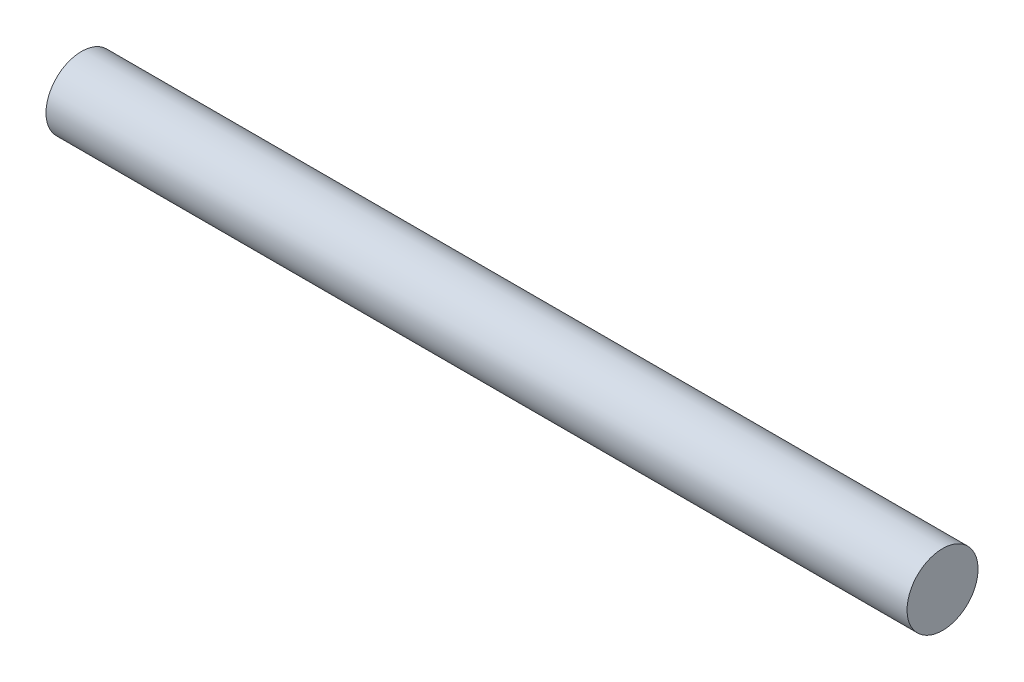
ISO-10303-21;
HEADER;
FILE_DESCRIPTION(('STEP AP214'),'2;1');
FILE_NAME('part.step','',(''),(''),'','','');
FILE_SCHEMA(('AUTOMOTIVE_DESIGN { 1 0 10303 214 1 1 1 1 }'));
ENDSEC;
DATA;
#1=APPLICATION_CONTEXT('core data for automotive mechanical design processes');
#2=APPLICATION_PROTOCOL_DEFINITION('international standard','automotive_design',2000,#1);
#3=PRODUCT_CONTEXT('',#1,'mechanical');
#4=PRODUCT('Part','Part','',(#3));
#5=PRODUCT_RELATED_PRODUCT_CATEGORY('part','',(#4));
#6=PRODUCT_DEFINITION_FORMATION('','',#4);
#7=PRODUCT_DEFINITION_CONTEXT('part definition',#1,'design');
#8=PRODUCT_DEFINITION('design','',#6,#7);
#9=PRODUCT_DEFINITION_SHAPE('','',#8);
#10=(LENGTH_UNIT() NAMED_UNIT(*) SI_UNIT(.MILLI.,.METRE.));
#11=(NAMED_UNIT(*) PLANE_ANGLE_UNIT() SI_UNIT($,.RADIAN.));
#12=(NAMED_UNIT(*) SI_UNIT($,.STERADIAN.) SOLID_ANGLE_UNIT());
#13=UNCERTAINTY_MEASURE_WITH_UNIT(LENGTH_MEASURE(1.E-05),#10,'distance_accuracy_value','');
#14=(GEOMETRIC_REPRESENTATION_CONTEXT(3) GLOBAL_UNCERTAINTY_ASSIGNED_CONTEXT((#13)) GLOBAL_UNIT_ASSIGNED_CONTEXT((#10,
#11,#12)) REPRESENTATION_CONTEXT('',''));
#15=CARTESIAN_POINT('',(0.,0.,0.));
#16=DIRECTION('',(0.,0.,1.));
#17=DIRECTION('',(1.,0.,0.));
#18=AXIS2_PLACEMENT_3D('',#15,#16,#17);
#19=CARTESIAN_POINT('',(48.5,0.,0.));
#20=DIRECTION('',(-1.,0.,0.));
#21=DIRECTION('',(0.,0.,1.));
#22=AXIS2_PLACEMENT_3D('',#19,#20,#21);
#23=CYLINDRICAL_SURFACE('',#22,4.);
#24=CARTESIAN_POINT('',(48.5,0.,0.));
#25=DIRECTION('',(1.,0.,0.));
#26=DIRECTION('',(0.,0.,-1.));
#27=AXIS2_PLACEMENT_3D('',#24,#25,#26);
#28=CIRCLE('',#27,4.);
#29=CARTESIAN_POINT('',(48.5,0.,4.));
#30=VERTEX_POINT('',#29);
#31=EDGE_CURVE('E10',#30,#30,#28,.T.);
#32=CARTESIAN_POINT('',(-48.5,0.,0.));
#33=DIRECTION('',(1.,0.,0.));
#34=DIRECTION('',(0.,0.,-1.));
#35=AXIS2_PLACEMENT_3D('',#32,#33,#34);
#36=CIRCLE('',#35,4.);
#37=CARTESIAN_POINT('',(-48.5,0.,4.));
#38=VERTEX_POINT('',#37);
#39=EDGE_CURVE('E44',#38,#38,#36,.T.);
#40=CARTESIAN_POINT('',(48.5,0.,4.));
#41=CARTESIAN_POINT('',(47.4895833333333,0.,4.));
#42=CARTESIAN_POINT('',(46.4791666666667,0.,4.));
#43=CARTESIAN_POINT('',(44.4583333333333,0.,4.));
#44=CARTESIAN_POINT('',(43.4479166666667,0.,4.));
#45=CARTESIAN_POINT('',(41.4270833333333,0.,4.));
#46=CARTESIAN_POINT('',(40.4166666666667,0.,4.));
#47=CARTESIAN_POINT('',(38.3958333333333,0.,4.));
#48=CARTESIAN_POINT('',(37.3854166666667,0.,4.));
#49=CARTESIAN_POINT('',(35.3645833333333,0.,4.));
#50=CARTESIAN_POINT('',(34.3541666666667,0.,4.));
#51=CARTESIAN_POINT('',(32.3333333333333,0.,4.));
#52=CARTESIAN_POINT('',(31.3229166666667,0.,4.));
#53=CARTESIAN_POINT('',(29.3020833333333,0.,4.));
#54=CARTESIAN_POINT('',(28.2916666666667,0.,4.));
#55=CARTESIAN_POINT('',(26.2708333333333,0.,4.));
#56=CARTESIAN_POINT('',(25.2604166666667,0.,4.));
#57=CARTESIAN_POINT('',(23.2395833333333,0.,4.));
#58=CARTESIAN_POINT('',(22.2291666666667,0.,4.));
#59=CARTESIAN_POINT('',(20.2083333333333,0.,4.));
#60=CARTESIAN_POINT('',(19.1979166666667,0.,4.));
#61=CARTESIAN_POINT('',(17.1770833333333,0.,4.));
#62=CARTESIAN_POINT('',(16.1666666666667,0.,4.));
#63=CARTESIAN_POINT('',(14.1458333333333,0.,4.));
#64=CARTESIAN_POINT('',(13.1354166666667,0.,4.));
#65=CARTESIAN_POINT('',(11.1145833333333,0.,4.));
#66=CARTESIAN_POINT('',(10.1041666666667,0.,4.));
#67=CARTESIAN_POINT('',(8.08333333333332,0.,4.));
#68=CARTESIAN_POINT('',(7.07291666666665,0.,4.));
#69=CARTESIAN_POINT('',(5.05208333333332,0.,4.));
#70=CARTESIAN_POINT('',(4.04166666666665,0.,4.));
#71=CARTESIAN_POINT('',(2.02083333333332,0.,4.));
#72=CARTESIAN_POINT('',(1.01041666666665,0.,4.));
#73=CARTESIAN_POINT('',(-1.01041666666668,0.,4.));
#74=CARTESIAN_POINT('',(-2.02083333333335,0.,4.));
#75=CARTESIAN_POINT('',(-4.04166666666668,0.,4.));
#76=CARTESIAN_POINT('',(-5.05208333333335,0.,4.));
#77=CARTESIAN_POINT('',(-7.07291666666668,0.,4.));
#78=CARTESIAN_POINT('',(-8.08333333333335,0.,4.));
#79=CARTESIAN_POINT('',(-10.1041666666667,0.,4.));
#80=CARTESIAN_POINT('',(-11.1145833333334,0.,4.));
#81=CARTESIAN_POINT('',(-13.1354166666667,0.,4.));
#82=CARTESIAN_POINT('',(-14.1458333333333,0.,4.));
#83=CARTESIAN_POINT('',(-16.1666666666667,0.,4.));
#84=CARTESIAN_POINT('',(-17.1770833333333,0.,4.));
#85=CARTESIAN_POINT('',(-19.1979166666667,0.,4.));
#86=CARTESIAN_POINT('',(-20.2083333333333,0.,4.));
#87=CARTESIAN_POINT('',(-22.2291666666667,0.,4.));
#88=CARTESIAN_POINT('',(-23.2395833333333,0.,4.));
#89=CARTESIAN_POINT('',(-25.2604166666667,0.,4.));
#90=CARTESIAN_POINT('',(-26.2708333333333,0.,4.));
#91=CARTESIAN_POINT('',(-28.2916666666667,0.,4.));
#92=CARTESIAN_POINT('',(-29.3020833333333,0.,4.));
#93=CARTESIAN_POINT('',(-31.3229166666667,0.,4.));
#94=CARTESIAN_POINT('',(-32.3333333333333,0.,4.));
#95=CARTESIAN_POINT('',(-34.3541666666667,0.,4.));
#96=CARTESIAN_POINT('',(-35.3645833333333,0.,4.));
#97=CARTESIAN_POINT('',(-37.3854166666667,0.,4.));
#98=CARTESIAN_POINT('',(-38.3958333333333,0.,4.));
#99=CARTESIAN_POINT('',(-40.4166666666667,0.,4.));
#100=CARTESIAN_POINT('',(-41.4270833333333,0.,4.));
#101=CARTESIAN_POINT('',(-43.4479166666667,0.,4.));
#102=CARTESIAN_POINT('',(-44.4583333333333,0.,4.));
#103=CARTESIAN_POINT('',(-46.4791666666667,0.,4.));
#104=CARTESIAN_POINT('',(-47.4895833333333,0.,4.));
#105=CARTESIAN_POINT('',(-48.5,0.,4.));
#106=B_SPLINE_CURVE_WITH_KNOTS('',3,(#40,#41,#42,#43,#44,#45,#46,#47,#48,#49,#50,#51,#52,#53,
#54,#55,#56,#57,#58,#59,#60,#61,#62,#63,#64,#65,#66,#67,#68,#69,#70,#71,#72,#73,#74,#75,#76,#77,
#78,#79,#80,#81,#82,#83,#84,#85,#86,#87,#88,#89,#90,#91,#92,#93,#94,#95,#96,#97,#98,#99,#100,
#101,#102,#103,#104,#105),.UNSPECIFIED.,.F.,.F.,(4,2,2,2,2,2,2,2,2,2,2,2,2,2,2,2,2,2,2,2,2,2,2,
2,2,2,2,2,2,2,2,2,4),(0.,3.03125,6.0625,9.09375,12.125,15.15625,18.1875,21.21875,24.25,27.28125,
30.3125,33.34375,36.375,39.40625,42.4375,45.46875,48.5,51.53125,54.5625,57.59375,60.625,
63.65625,66.6875,69.71875,72.75,75.78125,78.8125,81.84375,84.875,87.90625,90.9375,93.96875,97.),.UNSPECIFIED.);
#107=EDGE_CURVE('BSEAM41',#30,#38,#106,.T.);
#108=ORIENTED_EDGE('',*,*,#31,.F.);
#109=ORIENTED_EDGE('',*,*,#39,.T.);
#110=ORIENTED_EDGE('',*,*,#107,.T.);
#111=ORIENTED_EDGE('',*,*,#107,.F.);
#112=EDGE_LOOP('',(#108,#110,#109,#111));
#113=FACE_BOUND('',#112,.T.);
#114=ADVANCED_FACE('F41',(#113),#23,.T.);
#115=CARTESIAN_POINT('',(48.5,0.,0.));
#116=DIRECTION('',(1.,0.,0.));
#117=DIRECTION('',(0.,0.,-1.));
#118=AXIS2_PLACEMENT_3D('',#115,#116,#117);
#119=PLANE('',#118);
#120=ORIENTED_EDGE('',*,*,#31,.T.);
#121=EDGE_LOOP('',(#120));
#122=FACE_BOUND('',#121,.T.);
#123=ADVANCED_FACE('F58',(#122),#119,.T.);
#124=CARTESIAN_POINT('',(-48.5,0.,0.));
#125=DIRECTION('',(1.,0.,0.));
#126=DIRECTION('',(0.,0.,-1.));
#127=AXIS2_PLACEMENT_3D('',#124,#125,#126);
#128=PLANE('',#127);
#129=ORIENTED_EDGE('',*,*,#39,.F.);
#130=EDGE_LOOP('',(#129));
#131=FACE_BOUND('',#130,.T.);
#132=ADVANCED_FACE('F56',(#131),#128,.F.);
#133=CLOSED_SHELL('',(#114,#123,#132));
#134=MANIFOLD_SOLID_BREP('B2',#133);
#135=ADVANCED_BREP_SHAPE_REPRESENTATION('',(#18,#134),#14);
#136=SHAPE_DEFINITION_REPRESENTATION(#9,#135);
ENDSEC;
END-ISO-10303-21;
